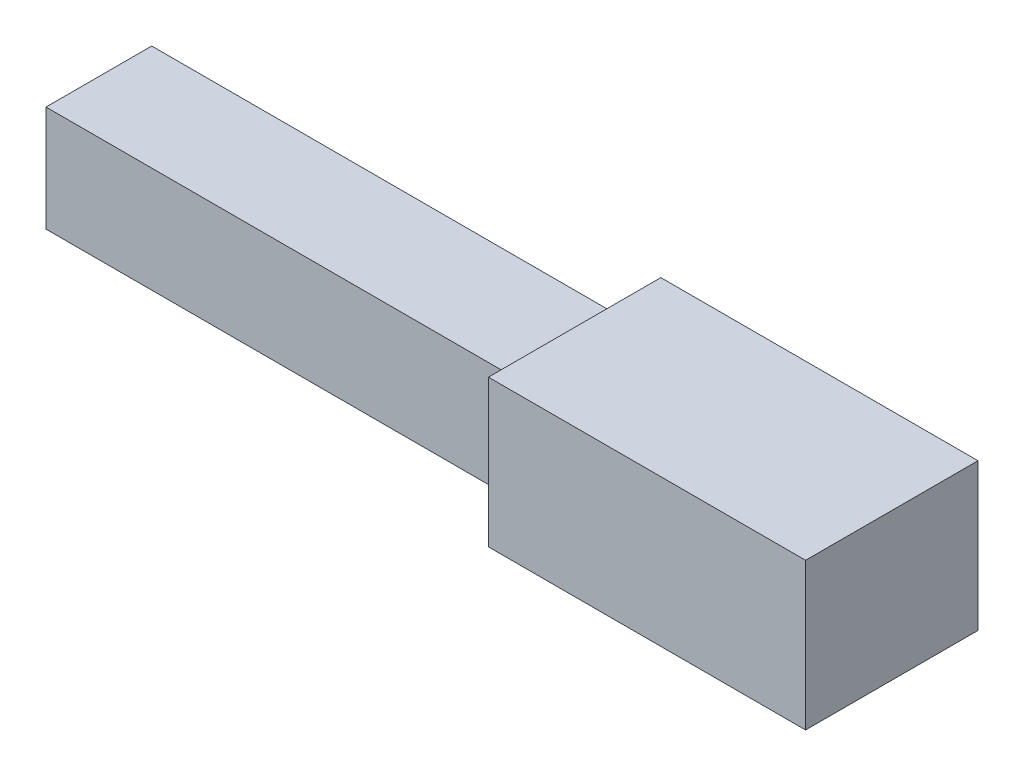
ISO-10303-21;
HEADER;
FILE_DESCRIPTION(('STEP AP214'),'2;1');
FILE_NAME('part.step','',(''),(''),'','','');
FILE_SCHEMA(('AUTOMOTIVE_DESIGN { 1 0 10303 214 1 1 1 1 }'));
ENDSEC;
DATA;
#1=APPLICATION_CONTEXT('core data for automotive mechanical design processes');
#2=APPLICATION_PROTOCOL_DEFINITION('international standard','automotive_design',2000,#1);
#3=PRODUCT_CONTEXT('',#1,'mechanical');
#4=PRODUCT('Part','Part','',(#3));
#5=PRODUCT_RELATED_PRODUCT_CATEGORY('part','',(#4));
#6=PRODUCT_DEFINITION_FORMATION('','',#4);
#7=PRODUCT_DEFINITION_CONTEXT('part definition',#1,'design');
#8=PRODUCT_DEFINITION('design','',#6,#7);
#9=PRODUCT_DEFINITION_SHAPE('','',#8);
#10=(LENGTH_UNIT() NAMED_UNIT(*) SI_UNIT(.MILLI.,.METRE.));
#11=(NAMED_UNIT(*) PLANE_ANGLE_UNIT() SI_UNIT($,.RADIAN.));
#12=(NAMED_UNIT(*) SI_UNIT($,.STERADIAN.) SOLID_ANGLE_UNIT());
#13=UNCERTAINTY_MEASURE_WITH_UNIT(LENGTH_MEASURE(1.E-05),#10,'distance_accuracy_value','');
#14=(GEOMETRIC_REPRESENTATION_CONTEXT(3) GLOBAL_UNCERTAINTY_ASSIGNED_CONTEXT((#13)) GLOBAL_UNIT_ASSIGNED_CONTEXT((#10,
#11,#12)) REPRESENTATION_CONTEXT('',''));
#15=CARTESIAN_POINT('',(0.,0.,0.));
#16=DIRECTION('',(0.,0.,1.));
#17=DIRECTION('',(1.,0.,0.));
#18=AXIS2_PLACEMENT_3D('',#15,#16,#17);
#19=CARTESIAN_POINT('',(180.,0.,0.));
#20=DIRECTION('',(0.,0.,-1.));
#21=DIRECTION('',(-1.,0.,0.));
#22=AXIS2_PLACEMENT_3D('',#19,#20,#21);
#23=PLANE('',#22);
#24=DIRECTION('',(0.,-1.,0.));
#25=VECTOR('',#24,1.);
#26=CARTESIAN_POINT('',(0.,0.,0.));
#27=LINE('',#26,#25);
#28=CARTESIAN_POINT('',(0.,40.,0.));
#29=VERTEX_POINT('',#28);
#30=CARTESIAN_POINT('',(0.,0.,0.));
#31=VERTEX_POINT('',#30);
#32=EDGE_CURVE('E131',#29,#31,#27,.T.);
#33=ORIENTED_EDGE('',*,*,#32,.T.);
#34=DIRECTION('',(-1.,0.,0.));
#35=VECTOR('',#34,1.);
#36=CARTESIAN_POINT('',(180.,0.,0.));
#37=LINE('',#36,#35);
#38=CARTESIAN_POINT('',(180.,0.,0.));
#39=VERTEX_POINT('',#38);
#40=EDGE_CURVE('E11',#39,#31,#37,.T.);
#41=ORIENTED_EDGE('',*,*,#40,.F.);
#42=DIRECTION('',(0.,-1.,0.));
#43=VECTOR('',#42,1.);
#44=CARTESIAN_POINT('',(180.,0.,0.));
#45=LINE('',#44,#43);
#46=CARTESIAN_POINT('',(180.,40.,0.));
#47=VERTEX_POINT('',#46);
#48=EDGE_CURVE('E140',#47,#39,#45,.T.);
#49=ORIENTED_EDGE('',*,*,#48,.F.);
#50=DIRECTION('',(-1.,0.,0.));
#51=VECTOR('',#50,1.);
#52=CARTESIAN_POINT('',(180.,40.,0.));
#53=LINE('',#52,#51);
#54=EDGE_CURVE('E149',#47,#29,#53,.T.);
#55=ORIENTED_EDGE('',*,*,#54,.T.);
#56=EDGE_LOOP('',(#33,#41,#49,#55));
#57=FACE_BOUND('',#56,.T.);
#58=ADVANCED_FACE('F33',(#57),#23,.F.);
#59=CARTESIAN_POINT('',(180.,0.,0.));
#60=DIRECTION('',(0.,1.,0.));
#61=DIRECTION('',(0.,0.,1.));
#62=AXIS2_PLACEMENT_3D('',#59,#60,#61);
#63=PLANE('',#62);
#64=DIRECTION('',(0.,0.,-1.));
#65=VECTOR('',#64,1.);
#66=CARTESIAN_POINT('',(0.,0.,0.));
#67=LINE('',#66,#65);
#68=CARTESIAN_POINT('',(0.,0.,-40.));
#69=VERTEX_POINT('',#68);
#70=EDGE_CURVE('E134',#31,#69,#67,.T.);
#71=ORIENTED_EDGE('',*,*,#70,.T.);
#72=DIRECTION('',(-1.,0.,0.));
#73=VECTOR('',#72,1.);
#74=CARTESIAN_POINT('',(180.,0.,-40.));
#75=LINE('',#74,#73);
#76=CARTESIAN_POINT('',(180.,0.,-40.));
#77=VERTEX_POINT('',#76);
#78=EDGE_CURVE('E41',#77,#69,#75,.T.);
#79=ORIENTED_EDGE('',*,*,#78,.F.);
#80=DIRECTION('',(0.,0.,-1.));
#81=VECTOR('',#80,1.);
#82=CARTESIAN_POINT('',(180.,0.,0.));
#83=LINE('',#82,#81);
#84=EDGE_CURVE('E75',#39,#77,#83,.T.);
#85=ORIENTED_EDGE('',*,*,#84,.F.);
#86=ORIENTED_EDGE('',*,*,#40,.T.);
#87=EDGE_LOOP('',(#71,#79,#85,#86));
#88=FACE_BOUND('',#87,.T.);
#89=ADVANCED_FACE('F175',(#88),#63,.F.);
#90=CARTESIAN_POINT('',(180.,0.,-40.));
#91=DIRECTION('',(0.,0.,1.));
#92=DIRECTION('',(1.,0.,0.));
#93=AXIS2_PLACEMENT_3D('',#90,#91,#92);
#94=PLANE('',#93);
#95=DIRECTION('',(0.,1.,0.));
#96=VECTOR('',#95,1.);
#97=CARTESIAN_POINT('',(0.,0.,-40.));
#98=LINE('',#97,#96);
#99=CARTESIAN_POINT('',(0.,40.,-40.));
#100=VERTEX_POINT('',#99);
#101=EDGE_CURVE('E65',#69,#100,#98,.T.);
#102=ORIENTED_EDGE('',*,*,#101,.T.);
#103=DIRECTION('',(-1.,0.,0.));
#104=VECTOR('',#103,1.);
#105=CARTESIAN_POINT('',(180.,40.,-40.));
#106=LINE('',#105,#104);
#107=CARTESIAN_POINT('',(180.,40.,-40.));
#108=VERTEX_POINT('',#107);
#109=EDGE_CURVE('E49',#108,#100,#106,.T.);
#110=ORIENTED_EDGE('',*,*,#109,.F.);
#111=DIRECTION('',(0.,1.,0.));
#112=VECTOR('',#111,1.);
#113=CARTESIAN_POINT('',(180.,0.,-40.));
#114=LINE('',#113,#112);
#115=EDGE_CURVE('E144',#77,#108,#114,.T.);
#116=ORIENTED_EDGE('',*,*,#115,.F.);
#117=ORIENTED_EDGE('',*,*,#78,.T.);
#118=EDGE_LOOP('',(#102,#110,#116,#117));
#119=FACE_BOUND('',#118,.T.);
#120=ADVANCED_FACE('F155',(#119),#94,.F.);
#121=CARTESIAN_POINT('',(180.,40.,0.));
#122=DIRECTION('',(0.,-1.,0.));
#123=DIRECTION('',(0.,0.,-1.));
#124=AXIS2_PLACEMENT_3D('',#121,#122,#123);
#125=PLANE('',#124);
#126=DIRECTION('',(0.,0.,1.));
#127=VECTOR('',#126,1.);
#128=CARTESIAN_POINT('',(0.,40.,0.));
#129=LINE('',#128,#127);
#130=EDGE_CURVE('E70',#100,#29,#129,.T.);
#131=ORIENTED_EDGE('',*,*,#130,.T.);
#132=ORIENTED_EDGE('',*,*,#54,.F.);
#133=DIRECTION('',(0.,0.,1.));
#134=VECTOR('',#133,1.);
#135=CARTESIAN_POINT('',(180.,40.,0.));
#136=LINE('',#135,#134);
#137=EDGE_CURVE('E147',#108,#47,#136,.T.);
#138=ORIENTED_EDGE('',*,*,#137,.F.);
#139=ORIENTED_EDGE('',*,*,#109,.T.);
#140=EDGE_LOOP('',(#131,#132,#138,#139));
#141=FACE_BOUND('',#140,.T.);
#142=ADVANCED_FACE('F160',(#141),#125,.F.);
#143=CARTESIAN_POINT('',(0.,0.,0.));
#144=DIRECTION('',(-1.,0.,0.));
#145=DIRECTION('',(0.,0.,1.));
#146=AXIS2_PLACEMENT_3D('',#143,#144,#145);
#147=PLANE('',#146);
#148=ORIENTED_EDGE('',*,*,#32,.F.);
#149=ORIENTED_EDGE('',*,*,#130,.F.);
#150=ORIENTED_EDGE('',*,*,#101,.F.);
#151=ORIENTED_EDGE('',*,*,#70,.F.);
#152=EDGE_LOOP('',(#148,#149,#150,#151));
#153=FACE_BOUND('',#152,.T.);
#154=ADVANCED_FACE('F158',(#153),#147,.T.);
#155=CARTESIAN_POINT('',(180.,0.,0.));
#156=DIRECTION('',(1.,0.,0.));
#157=DIRECTION('',(0.,0.,-1.));
#158=AXIS2_PLACEMENT_3D('',#155,#156,#157);
#159=PLANE('',#158);
#160=DIRECTION('',(0.,1.,0.));
#161=VECTOR('',#160,1.);
#162=CARTESIAN_POINT('',(180.,47.8057311158396,-52.6145949011223));
#163=LINE('',#162,#161);
#164=CARTESIAN_POINT('',(180.,-7.80573111583957,-52.6145949011223));
#165=VERTEX_POINT('',#164);
#166=CARTESIAN_POINT('',(180.,47.8057311158396,-52.6145949011223));
#167=VERTEX_POINT('',#166);
#168=EDGE_CURVE('E130',#165,#167,#163,.T.);
#169=ORIENTED_EDGE('',*,*,#168,.F.);
#170=DIRECTION('',(0.,0.,-1.));
#171=VECTOR('',#170,1.);
#172=CARTESIAN_POINT('',(180.,-7.80573111583957,12.6145949011223));
#173=LINE('',#172,#171);
#174=CARTESIAN_POINT('',(180.,-7.80573111583957,12.6145949011223));
#175=VERTEX_POINT('',#174);
#176=EDGE_CURVE('E126',#175,#165,#173,.T.);
#177=ORIENTED_EDGE('',*,*,#176,.F.);
#178=DIRECTION('',(0.,-1.,0.));
#179=VECTOR('',#178,1.);
#180=CARTESIAN_POINT('',(180.,47.8057311158396,12.6145949011223));
#181=LINE('',#180,#179);
#182=CARTESIAN_POINT('',(180.,47.8057311158396,12.6145949011223));
#183=VERTEX_POINT('',#182);
#184=EDGE_CURVE('E203',#183,#175,#181,.T.);
#185=ORIENTED_EDGE('',*,*,#184,.F.);
#186=DIRECTION('',(0.,0.,1.));
#187=VECTOR('',#186,1.);
#188=CARTESIAN_POINT('',(180.,47.8057311158396,12.6145949011223));
#189=LINE('',#188,#187);
#190=EDGE_CURVE('E206',#167,#183,#189,.T.);
#191=ORIENTED_EDGE('',*,*,#190,.F.);
#192=EDGE_LOOP('',(#169,#177,#185,#191));
#193=FACE_BOUND('',#192,.T.);
#194=ORIENTED_EDGE('',*,*,#137,.T.);
#195=ORIENTED_EDGE('',*,*,#48,.T.);
#196=ORIENTED_EDGE('',*,*,#84,.T.);
#197=ORIENTED_EDGE('',*,*,#115,.T.);
#198=EDGE_LOOP('',(#194,#195,#196,#197));
#199=FACE_BOUND('',#198,.T.);
#200=ADVANCED_FACE('F162',(#193,#199),#159,.F.);
#201=CARTESIAN_POINT('',(300.,47.8057311158396,-52.6145949011223));
#202=DIRECTION('',(0.,0.,1.));
#203=DIRECTION('',(1.,0.,0.));
#204=AXIS2_PLACEMENT_3D('',#201,#202,#203);
#205=PLANE('',#204);
#206=ORIENTED_EDGE('',*,*,#168,.T.);
#207=DIRECTION('',(-1.,0.,0.));
#208=VECTOR('',#207,1.);
#209=CARTESIAN_POINT('',(300.,47.8057311158396,-52.6145949011223));
#210=LINE('',#209,#208);
#211=CARTESIAN_POINT('',(300.,47.8057311158396,-52.6145949011223));
#212=VERTEX_POINT('',#211);
#213=EDGE_CURVE('E110',#212,#167,#210,.T.);
#214=ORIENTED_EDGE('',*,*,#213,.F.);
#215=DIRECTION('',(0.,1.,0.));
#216=VECTOR('',#215,1.);
#217=CARTESIAN_POINT('',(300.,47.8057311158396,-52.6145949011223));
#218=LINE('',#217,#216);
#219=CARTESIAN_POINT('',(300.,-7.80573111583957,-52.6145949011223));
#220=VERTEX_POINT('',#219);
#221=EDGE_CURVE('E117',#220,#212,#218,.T.);
#222=ORIENTED_EDGE('',*,*,#221,.F.);
#223=DIRECTION('',(-1.,0.,0.));
#224=VECTOR('',#223,1.);
#225=CARTESIAN_POINT('',(300.,-7.80573111583957,-52.6145949011223));
#226=LINE('',#225,#224);
#227=EDGE_CURVE('E200',#220,#165,#226,.T.);
#228=ORIENTED_EDGE('',*,*,#227,.T.);
#229=EDGE_LOOP('',(#206,#214,#222,#228));
#230=FACE_BOUND('',#229,.T.);
#231=ADVANCED_FACE('F128',(#230),#205,.F.);
#232=CARTESIAN_POINT('',(300.,47.8057311158396,12.6145949011223));
#233=DIRECTION('',(0.,-1.,0.));
#234=DIRECTION('',(0.,0.,-1.));
#235=AXIS2_PLACEMENT_3D('',#232,#233,#234);
#236=PLANE('',#235);
#237=ORIENTED_EDGE('',*,*,#190,.T.);
#238=DIRECTION('',(-1.,0.,0.));
#239=VECTOR('',#238,1.);
#240=CARTESIAN_POINT('',(300.,47.8057311158396,12.6145949011223));
#241=LINE('',#240,#239);
#242=CARTESIAN_POINT('',(300.,47.8057311158396,12.6145949011223));
#243=VERTEX_POINT('',#242);
#244=EDGE_CURVE('E113',#243,#183,#241,.T.);
#245=ORIENTED_EDGE('',*,*,#244,.F.);
#246=DIRECTION('',(0.,0.,1.));
#247=VECTOR('',#246,1.);
#248=CARTESIAN_POINT('',(300.,47.8057311158396,12.6145949011223));
#249=LINE('',#248,#247);
#250=EDGE_CURVE('E106',#212,#243,#249,.T.);
#251=ORIENTED_EDGE('',*,*,#250,.F.);
#252=ORIENTED_EDGE('',*,*,#213,.T.);
#253=EDGE_LOOP('',(#237,#245,#251,#252));
#254=FACE_BOUND('',#253,.T.);
#255=ADVANCED_FACE('F108',(#254),#236,.F.);
#256=CARTESIAN_POINT('',(300.,47.8057311158396,12.6145949011223));
#257=DIRECTION('',(0.,0.,-1.));
#258=DIRECTION('',(-1.,0.,0.));
#259=AXIS2_PLACEMENT_3D('',#256,#257,#258);
#260=PLANE('',#259);
#261=ORIENTED_EDGE('',*,*,#184,.T.);
#262=DIRECTION('',(-1.,0.,0.));
#263=VECTOR('',#262,1.);
#264=CARTESIAN_POINT('',(300.,-7.80573111583957,12.6145949011223));
#265=LINE('',#264,#263);
#266=CARTESIAN_POINT('',(300.,-7.80573111583957,12.6145949011223));
#267=VERTEX_POINT('',#266);
#268=EDGE_CURVE('E136',#267,#175,#265,.T.);
#269=ORIENTED_EDGE('',*,*,#268,.F.);
#270=DIRECTION('',(0.,-1.,0.));
#271=VECTOR('',#270,1.);
#272=CARTESIAN_POINT('',(300.,47.8057311158396,12.6145949011223));
#273=LINE('',#272,#271);
#274=EDGE_CURVE('E116',#243,#267,#273,.T.);
#275=ORIENTED_EDGE('',*,*,#274,.F.);
#276=ORIENTED_EDGE('',*,*,#244,.T.);
#277=EDGE_LOOP('',(#261,#269,#275,#276));
#278=FACE_BOUND('',#277,.T.);
#279=ADVANCED_FACE('F189',(#278),#260,.F.);
#280=CARTESIAN_POINT('',(300.,-7.80573111583957,12.6145949011223));
#281=DIRECTION('',(0.,1.,0.));
#282=DIRECTION('',(0.,0.,1.));
#283=AXIS2_PLACEMENT_3D('',#280,#281,#282);
#284=PLANE('',#283);
#285=ORIENTED_EDGE('',*,*,#176,.T.);
#286=ORIENTED_EDGE('',*,*,#227,.F.);
#287=DIRECTION('',(0.,0.,-1.));
#288=VECTOR('',#287,1.);
#289=CARTESIAN_POINT('',(300.,-7.80573111583957,12.6145949011223));
#290=LINE('',#289,#288);
#291=EDGE_CURVE('E122',#267,#220,#290,.T.);
#292=ORIENTED_EDGE('',*,*,#291,.F.);
#293=ORIENTED_EDGE('',*,*,#268,.T.);
#294=EDGE_LOOP('',(#285,#286,#292,#293));
#295=FACE_BOUND('',#294,.T.);
#296=ADVANCED_FACE('F191',(#295),#284,.F.);
#297=CARTESIAN_POINT('',(300.,0.,0.));
#298=DIRECTION('',(1.,0.,0.));
#299=DIRECTION('',(0.,0.,-1.));
#300=AXIS2_PLACEMENT_3D('',#297,#298,#299);
#301=PLANE('',#300);
#302=ORIENTED_EDGE('',*,*,#221,.T.);
#303=ORIENTED_EDGE('',*,*,#250,.T.);
#304=ORIENTED_EDGE('',*,*,#274,.T.);
#305=ORIENTED_EDGE('',*,*,#291,.T.);
#306=EDGE_LOOP('',(#302,#303,#304,#305));
#307=FACE_BOUND('',#306,.T.);
#308=ADVANCED_FACE('F120',(#307),#301,.T.);
#309=CLOSED_SHELL('',(#58,#89,#120,#142,#154,#200,#231,#255,#279,#296,#308));
#310=MANIFOLD_SOLID_BREP('B2',#309);
#311=ADVANCED_BREP_SHAPE_REPRESENTATION('',(#18,#310),#14);
#312=SHAPE_DEFINITION_REPRESENTATION(#9,#311);
ENDSEC;
END-ISO-10303-21;
